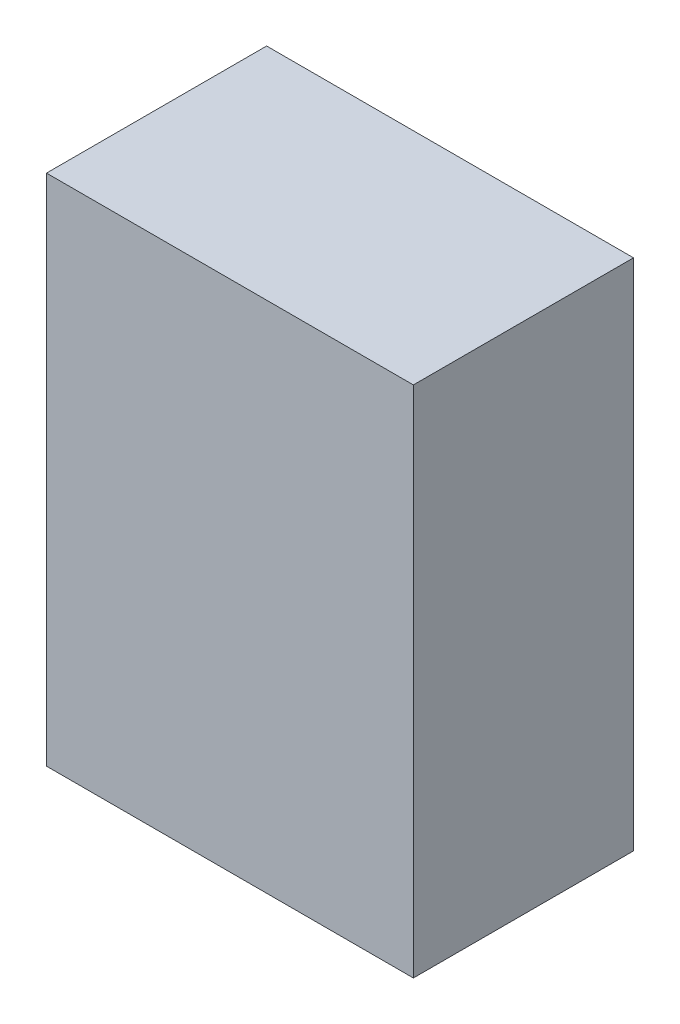
ISO-10303-21;
HEADER;
FILE_DESCRIPTION(('STEP AP214'),'2;1');
FILE_NAME('part.step','',(''),(''),'','','');
FILE_SCHEMA(('AUTOMOTIVE_DESIGN { 1 0 10303 214 1 1 1 1 }'));
ENDSEC;
DATA;
#1=APPLICATION_CONTEXT('core data for automotive mechanical design processes');
#2=APPLICATION_PROTOCOL_DEFINITION('international standard','automotive_design',2000,#1);
#3=PRODUCT_CONTEXT('',#1,'mechanical');
#4=PRODUCT('Part','Part','',(#3));
#5=PRODUCT_RELATED_PRODUCT_CATEGORY('part','',(#4));
#6=PRODUCT_DEFINITION_FORMATION('','',#4);
#7=PRODUCT_DEFINITION_CONTEXT('part definition',#1,'design');
#8=PRODUCT_DEFINITION('design','',#6,#7);
#9=PRODUCT_DEFINITION_SHAPE('','',#8);
#10=(LENGTH_UNIT() NAMED_UNIT(*) SI_UNIT(.MILLI.,.METRE.));
#11=(NAMED_UNIT(*) PLANE_ANGLE_UNIT() SI_UNIT($,.RADIAN.));
#12=(NAMED_UNIT(*) SI_UNIT($,.STERADIAN.) SOLID_ANGLE_UNIT());
#13=UNCERTAINTY_MEASURE_WITH_UNIT(LENGTH_MEASURE(1.E-05),#10,'distance_accuracy_value','');
#14=(GEOMETRIC_REPRESENTATION_CONTEXT(3) GLOBAL_UNCERTAINTY_ASSIGNED_CONTEXT((#13)) GLOBAL_UNIT_ASSIGNED_CONTEXT((#10,
#11,#12)) REPRESENTATION_CONTEXT('',''));
#15=CARTESIAN_POINT('',(0.,0.,0.));
#16=DIRECTION('',(0.,0.,1.));
#17=DIRECTION('',(1.,0.,0.));
#18=AXIS2_PLACEMENT_3D('',#15,#16,#17);
#19=CARTESIAN_POINT('',(50.872900390625,48.305400396213,1.306800003052));
#20=DIRECTION('',(0.,0.,1.));
#21=DIRECTION('',(1.,0.,0.));
#22=AXIS2_PLACEMENT_3D('',#19,#20,#21);
#23=PLANE('',#22);
#24=DIRECTION('',(1.,0.,0.));
#25=VECTOR('',#24,1.);
#26=CARTESIAN_POINT('',(50.872900390625,48.480400360078,1.306800003052));
#27=LINE('',#26,#25);
#28=CARTESIAN_POINT('',(50.747900379263,48.480400360078,1.306800003052));
#29=VERTEX_POINT('',#28);
#30=CARTESIAN_POINT('',(50.997900401987,48.480400360078,1.306800003052));
#31=VERTEX_POINT('',#30);
#32=EDGE_CURVE('E94',#29,#31,#27,.T.);
#33=ORIENTED_EDGE('',*,*,#32,.F.);
#34=DIRECTION('',(0.,1.,0.));
#35=VECTOR('',#34,1.);
#36=CARTESIAN_POINT('',(50.747900379263,48.305400396213,1.306800003052));
#37=LINE('',#36,#35);
#38=CARTESIAN_POINT('',(50.747900379263,48.130400432348,1.306800003052));
#39=VERTEX_POINT('',#38);
#40=EDGE_CURVE('E11',#39,#29,#37,.T.);
#41=ORIENTED_EDGE('',*,*,#40,.F.);
#42=DIRECTION('',(-1.,0.,0.));
#43=VECTOR('',#42,1.);
#44=CARTESIAN_POINT('',(50.872900390625,48.130400432348,1.306800003052));
#45=LINE('',#44,#43);
#46=CARTESIAN_POINT('',(50.997900401987,48.130400432348,1.306800003052));
#47=VERTEX_POINT('',#46);
#48=EDGE_CURVE('E107',#47,#39,#45,.T.);
#49=ORIENTED_EDGE('',*,*,#48,.F.);
#50=DIRECTION('',(0.,-1.,0.));
#51=VECTOR('',#50,1.);
#52=CARTESIAN_POINT('',(50.997900401987,48.305400396213,1.306800003052));
#53=LINE('',#52,#51);
#54=EDGE_CURVE('E89',#31,#47,#53,.T.);
#55=ORIENTED_EDGE('',*,*,#54,.F.);
#56=EDGE_LOOP('',(#33,#41,#49,#55));
#57=FACE_BOUND('',#56,.T.);
#58=ADVANCED_FACE('F17',(#57),#23,.T.);
#59=CARTESIAN_POINT('',(50.747900379263,48.305400396213,1.156800003052));
#60=DIRECTION('',(-1.,0.,0.));
#61=DIRECTION('',(0.,0.,1.));
#62=AXIS2_PLACEMENT_3D('',#59,#60,#61);
#63=PLANE('',#62);
#64=ORIENTED_EDGE('',*,*,#40,.T.);
#65=DIRECTION('',(0.,0.,1.));
#66=VECTOR('',#65,1.);
#67=CARTESIAN_POINT('',(50.747900379263,48.480400360078,1.156800003052));
#68=LINE('',#67,#66);
#69=CARTESIAN_POINT('',(50.747900379263,48.480400360078,1.156800003052));
#70=VERTEX_POINT('',#69);
#71=EDGE_CURVE('E83',#70,#29,#68,.T.);
#72=ORIENTED_EDGE('',*,*,#71,.F.);
#73=DIRECTION('',(0.,-1.,0.));
#74=VECTOR('',#73,1.);
#75=CARTESIAN_POINT('',(50.747900379263,48.305400396213,1.156800003052));
#76=LINE('',#75,#74);
#77=CARTESIAN_POINT('',(50.747900379263,48.130400432348,1.156800003052));
#78=VERTEX_POINT('',#77);
#79=EDGE_CURVE('E86',#70,#78,#76,.T.);
#80=ORIENTED_EDGE('',*,*,#79,.T.);
#81=DIRECTION('',(0.,0.,-1.));
#82=VECTOR('',#81,1.);
#83=CARTESIAN_POINT('',(50.747900379263,48.130400432348,1.156800003052));
#84=LINE('',#83,#82);
#85=EDGE_CURVE('E28',#39,#78,#84,.T.);
#86=ORIENTED_EDGE('',*,*,#85,.F.);
#87=EDGE_LOOP('',(#64,#72,#80,#86));
#88=FACE_BOUND('',#87,.T.);
#89=ADVANCED_FACE('F84',(#88),#63,.T.);
#90=CARTESIAN_POINT('',(50.872900390625,48.130400432348,1.156800003052));
#91=DIRECTION('',(0.,-1.,0.));
#92=DIRECTION('',(-1.,0.,0.));
#93=AXIS2_PLACEMENT_3D('',#90,#91,#92);
#94=PLANE('',#93);
#95=ORIENTED_EDGE('',*,*,#48,.T.);
#96=ORIENTED_EDGE('',*,*,#85,.T.);
#97=DIRECTION('',(1.,0.,0.));
#98=VECTOR('',#97,1.);
#99=CARTESIAN_POINT('',(50.872900390625,48.130400432348,1.156800003052));
#100=LINE('',#99,#98);
#101=CARTESIAN_POINT('',(50.997900401987,48.130400432348,1.156800003052));
#102=VERTEX_POINT('',#101);
#103=EDGE_CURVE('E95',#78,#102,#100,.T.);
#104=ORIENTED_EDGE('',*,*,#103,.T.);
#105=DIRECTION('',(0.,0.,-1.));
#106=VECTOR('',#105,1.);
#107=CARTESIAN_POINT('',(50.997900401987,48.130400432348,1.156800003052));
#108=LINE('',#107,#106);
#109=EDGE_CURVE('E70',#47,#102,#108,.T.);
#110=ORIENTED_EDGE('',*,*,#109,.F.);
#111=EDGE_LOOP('',(#95,#96,#104,#110));
#112=FACE_BOUND('',#111,.T.);
#113=ADVANCED_FACE('F124',(#112),#94,.T.);
#114=CARTESIAN_POINT('',(50.997900401987,48.305400396213,1.156800003052));
#115=DIRECTION('',(1.,0.,0.));
#116=DIRECTION('',(0.,-1.,0.));
#117=AXIS2_PLACEMENT_3D('',#114,#115,#116);
#118=PLANE('',#117);
#119=ORIENTED_EDGE('',*,*,#54,.T.);
#120=ORIENTED_EDGE('',*,*,#109,.T.);
#121=DIRECTION('',(0.,1.,0.));
#122=VECTOR('',#121,1.);
#123=CARTESIAN_POINT('',(50.997900401987,48.305400396213,1.156800003052));
#124=LINE('',#123,#122);
#125=CARTESIAN_POINT('',(50.997900401987,48.480400360078,1.156800003052));
#126=VERTEX_POINT('',#125);
#127=EDGE_CURVE('E102',#102,#126,#124,.T.);
#128=ORIENTED_EDGE('',*,*,#127,.T.);
#129=DIRECTION('',(0.,0.,-1.));
#130=VECTOR('',#129,1.);
#131=CARTESIAN_POINT('',(50.997900401987,48.480400360078,1.156800003052));
#132=LINE('',#131,#130);
#133=EDGE_CURVE('E57',#31,#126,#132,.T.);
#134=ORIENTED_EDGE('',*,*,#133,.F.);
#135=EDGE_LOOP('',(#119,#120,#128,#134));
#136=FACE_BOUND('',#135,.T.);
#137=ADVANCED_FACE('F122',(#136),#118,.T.);
#138=CARTESIAN_POINT('',(50.872900390625,48.480400360078,1.156800003052));
#139=DIRECTION('',(0.,1.,0.));
#140=DIRECTION('',(1.,0.,0.));
#141=AXIS2_PLACEMENT_3D('',#138,#139,#140);
#142=PLANE('',#141);
#143=ORIENTED_EDGE('',*,*,#32,.T.);
#144=ORIENTED_EDGE('',*,*,#133,.T.);
#145=DIRECTION('',(-1.,0.,0.));
#146=VECTOR('',#145,1.);
#147=CARTESIAN_POINT('',(50.872900390625,48.480400360078,1.156800003052));
#148=LINE('',#147,#146);
#149=EDGE_CURVE('E21',#126,#70,#148,.T.);
#150=ORIENTED_EDGE('',*,*,#149,.T.);
#151=ORIENTED_EDGE('',*,*,#71,.T.);
#152=EDGE_LOOP('',(#143,#144,#150,#151));
#153=FACE_BOUND('',#152,.T.);
#154=ADVANCED_FACE('F90',(#153),#142,.T.);
#155=CARTESIAN_POINT('',(50.872900390625,48.305400396213,1.156800003052));
#156=DIRECTION('',(0.,0.,1.));
#157=DIRECTION('',(1.,0.,0.));
#158=AXIS2_PLACEMENT_3D('',#155,#156,#157);
#159=PLANE('',#158);
#160=ORIENTED_EDGE('',*,*,#127,.F.);
#161=ORIENTED_EDGE('',*,*,#103,.F.);
#162=ORIENTED_EDGE('',*,*,#79,.F.);
#163=ORIENTED_EDGE('',*,*,#149,.F.);
#164=EDGE_LOOP('',(#160,#161,#162,#163));
#165=FACE_BOUND('',#164,.T.);
#166=ADVANCED_FACE('F19',(#165),#159,.F.);
#167=CLOSED_SHELL('',(#58,#89,#113,#137,#154,#166));
#168=MANIFOLD_SOLID_BREP('B1',#167);
#169=ADVANCED_BREP_SHAPE_REPRESENTATION('',(#18,#168),#14);
#170=SHAPE_DEFINITION_REPRESENTATION(#9,#169);
ENDSEC;
END-ISO-10303-21;
